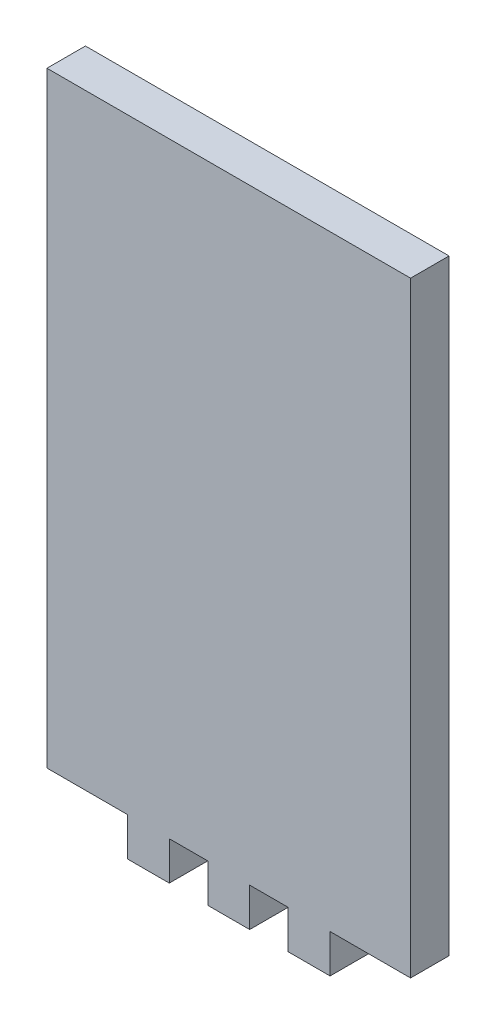
ISO-10303-21;
HEADER;
FILE_DESCRIPTION(('STEP AP214'),'2;1');
FILE_NAME('part.step','',(''),(''),'','','');
FILE_SCHEMA(('AUTOMOTIVE_DESIGN { 1 0 10303 214 1 1 1 1 }'));
ENDSEC;
DATA;
#1=APPLICATION_CONTEXT('core data for automotive mechanical design processes');
#2=APPLICATION_PROTOCOL_DEFINITION('international standard','automotive_design',2000,#1);
#3=PRODUCT_CONTEXT('',#1,'mechanical');
#4=PRODUCT('Part','Part','',(#3));
#5=PRODUCT_RELATED_PRODUCT_CATEGORY('part','',(#4));
#6=PRODUCT_DEFINITION_FORMATION('','',#4);
#7=PRODUCT_DEFINITION_CONTEXT('part definition',#1,'design');
#8=PRODUCT_DEFINITION('design','',#6,#7);
#9=PRODUCT_DEFINITION_SHAPE('','',#8);
#10=(LENGTH_UNIT() NAMED_UNIT(*) SI_UNIT(.MILLI.,.METRE.));
#11=(NAMED_UNIT(*) PLANE_ANGLE_UNIT() SI_UNIT($,.RADIAN.));
#12=(NAMED_UNIT(*) SI_UNIT($,.STERADIAN.) SOLID_ANGLE_UNIT());
#13=UNCERTAINTY_MEASURE_WITH_UNIT(LENGTH_MEASURE(1.E-05),#10,'distance_accuracy_value','');
#14=(GEOMETRIC_REPRESENTATION_CONTEXT(3) GLOBAL_UNCERTAINTY_ASSIGNED_CONTEXT((#13)) GLOBAL_UNIT_ASSIGNED_CONTEXT((#10,
#11,#12)) REPRESENTATION_CONTEXT('',''));
#15=CARTESIAN_POINT('',(0.,0.,0.));
#16=DIRECTION('',(0.,0.,1.));
#17=DIRECTION('',(1.,0.,0.));
#18=AXIS2_PLACEMENT_3D('',#15,#16,#17);
#19=CARTESIAN_POINT('',(60.,6.35,6.35));
#20=DIRECTION('',(-1.,0.,0.));
#21=DIRECTION('',(0.,0.,1.));
#22=AXIS2_PLACEMENT_3D('',#19,#20,#21);
#23=PLANE('',#22);
#24=DIRECTION('',(0.,1.,0.));
#25=VECTOR('',#24,1.);
#26=CARTESIAN_POINT('',(60.,6.35,0.));
#27=LINE('',#26,#25);
#28=CARTESIAN_POINT('',(60.,6.35,0.));
#29=VERTEX_POINT('',#28);
#30=CARTESIAN_POINT('',(60.,106.36,0.));
#31=VERTEX_POINT('',#30);
#32=EDGE_CURVE('E189',#29,#31,#27,.T.);
#33=ORIENTED_EDGE('',*,*,#32,.T.);
#34=DIRECTION('',(0.,0.,-1.));
#35=VECTOR('',#34,1.);
#36=CARTESIAN_POINT('',(60.,106.36,6.35));
#37=LINE('',#36,#35);
#38=CARTESIAN_POINT('',(60.,106.36,6.35));
#39=VERTEX_POINT('',#38);
#40=EDGE_CURVE('E11',#39,#31,#37,.T.);
#41=ORIENTED_EDGE('',*,*,#40,.F.);
#42=DIRECTION('',(0.,1.,0.));
#43=VECTOR('',#42,1.);
#44=CARTESIAN_POINT('',(60.,6.35,6.35));
#45=LINE('',#44,#43);
#46=CARTESIAN_POINT('',(60.,6.35,6.35));
#47=VERTEX_POINT('',#46);
#48=EDGE_CURVE('E237',#47,#39,#45,.T.);
#49=ORIENTED_EDGE('',*,*,#48,.F.);
#50=DIRECTION('',(0.,0.,-1.));
#51=VECTOR('',#50,1.);
#52=CARTESIAN_POINT('',(60.,6.35,6.35));
#53=LINE('',#52,#51);
#54=EDGE_CURVE('E185',#47,#29,#53,.T.);
#55=ORIENTED_EDGE('',*,*,#54,.T.);
#56=EDGE_LOOP('',(#33,#41,#49,#55));
#57=FACE_BOUND('',#56,.T.);
#58=ADVANCED_FACE('F39',(#57),#23,.F.);
#59=CARTESIAN_POINT('',(0.,106.36,6.35));
#60=DIRECTION('',(0.,-1.,0.));
#61=DIRECTION('',(0.,0.,-1.));
#62=AXIS2_PLACEMENT_3D('',#59,#60,#61);
#63=PLANE('',#62);
#64=DIRECTION('',(-1.,0.,0.));
#65=VECTOR('',#64,1.);
#66=CARTESIAN_POINT('',(0.,106.36,0.));
#67=LINE('',#66,#65);
#68=CARTESIAN_POINT('',(0.,106.36,0.));
#69=VERTEX_POINT('',#68);
#70=EDGE_CURVE('E193',#31,#69,#67,.T.);
#71=ORIENTED_EDGE('',*,*,#70,.T.);
#72=DIRECTION('',(0.,0.,-1.));
#73=VECTOR('',#72,1.);
#74=CARTESIAN_POINT('',(0.,106.36,6.35));
#75=LINE('',#74,#73);
#76=CARTESIAN_POINT('',(0.,106.36,6.35));
#77=VERTEX_POINT('',#76);
#78=EDGE_CURVE('E48',#77,#69,#75,.T.);
#79=ORIENTED_EDGE('',*,*,#78,.F.);
#80=DIRECTION('',(-1.,0.,0.));
#81=VECTOR('',#80,1.);
#82=CARTESIAN_POINT('',(0.,106.36,6.35));
#83=LINE('',#82,#81);
#84=EDGE_CURVE('E121',#39,#77,#83,.T.);
#85=ORIENTED_EDGE('',*,*,#84,.F.);
#86=ORIENTED_EDGE('',*,*,#40,.T.);
#87=EDGE_LOOP('',(#71,#79,#85,#86));
#88=FACE_BOUND('',#87,.T.);
#89=ADVANCED_FACE('F351',(#88),#63,.F.);
#90=CARTESIAN_POINT('',(0.,6.35,6.35));
#91=DIRECTION('',(1.,0.,0.));
#92=DIRECTION('',(0.,0.,-1.));
#93=AXIS2_PLACEMENT_3D('',#90,#91,#92);
#94=PLANE('',#93);
#95=DIRECTION('',(0.,-1.,0.));
#96=VECTOR('',#95,1.);
#97=CARTESIAN_POINT('',(0.,6.35,0.));
#98=LINE('',#97,#96);
#99=CARTESIAN_POINT('',(0.,6.35,0.));
#100=VERTEX_POINT('',#99);
#101=EDGE_CURVE('E196',#69,#100,#98,.T.);
#102=ORIENTED_EDGE('',*,*,#101,.T.);
#103=DIRECTION('',(0.,0.,-1.));
#104=VECTOR('',#103,1.);
#105=CARTESIAN_POINT('',(0.,6.35,6.35));
#106=LINE('',#105,#104);
#107=CARTESIAN_POINT('',(0.,6.35,6.35));
#108=VERTEX_POINT('',#107);
#109=EDGE_CURVE('E280',#108,#100,#106,.T.);
#110=ORIENTED_EDGE('',*,*,#109,.F.);
#111=DIRECTION('',(0.,-1.,0.));
#112=VECTOR('',#111,1.);
#113=CARTESIAN_POINT('',(0.,6.35,6.35));
#114=LINE('',#113,#112);
#115=EDGE_CURVE('E290',#77,#108,#114,.T.);
#116=ORIENTED_EDGE('',*,*,#115,.F.);
#117=ORIENTED_EDGE('',*,*,#78,.T.);
#118=EDGE_LOOP('',(#102,#110,#116,#117));
#119=FACE_BOUND('',#118,.T.);
#120=ADVANCED_FACE('F288',(#119),#94,.F.);
#121=CARTESIAN_POINT('',(6.912,6.35,6.35));
#122=DIRECTION('',(0.,1.,0.));
#123=DIRECTION('',(0.,0.,1.));
#124=AXIS2_PLACEMENT_3D('',#121,#122,#123);
#125=PLANE('',#124);
#126=DIRECTION('',(1.,0.,0.));
#127=VECTOR('',#126,1.);
#128=CARTESIAN_POINT('',(6.912,6.35,0.));
#129=LINE('',#128,#127);
#130=CARTESIAN_POINT('',(13.272,6.35,0.));
#131=VERTEX_POINT('',#130);
#132=EDGE_CURVE('E200',#100,#131,#129,.T.);
#133=ORIENTED_EDGE('',*,*,#132,.T.);
#134=DIRECTION('',(0.,0.,-1.));
#135=VECTOR('',#134,1.);
#136=CARTESIAN_POINT('',(13.272,6.35,6.35));
#137=LINE('',#136,#135);
#138=CARTESIAN_POINT('',(13.272,6.35,6.35));
#139=VERTEX_POINT('',#138);
#140=EDGE_CURVE('E276',#139,#131,#137,.T.);
#141=ORIENTED_EDGE('',*,*,#140,.F.);
#142=DIRECTION('',(1.,0.,0.));
#143=VECTOR('',#142,1.);
#144=CARTESIAN_POINT('',(6.912,6.35,6.35));
#145=LINE('',#144,#143);
#146=EDGE_CURVE('E306',#108,#139,#145,.T.);
#147=ORIENTED_EDGE('',*,*,#146,.F.);
#148=ORIENTED_EDGE('',*,*,#109,.T.);
#149=EDGE_LOOP('',(#133,#141,#147,#148));
#150=FACE_BOUND('',#149,.T.);
#151=ADVANCED_FACE('F296',(#150),#125,.F.);
#152=CARTESIAN_POINT('',(13.272,0.,6.35));
#153=DIRECTION('',(1.,0.,0.));
#154=DIRECTION('',(0.,0.,-1.));
#155=AXIS2_PLACEMENT_3D('',#152,#153,#154);
#156=PLANE('',#155);
#157=DIRECTION('',(0.,-1.,0.));
#158=VECTOR('',#157,1.);
#159=CARTESIAN_POINT('',(13.272,0.,0.));
#160=LINE('',#159,#158);
#161=CARTESIAN_POINT('',(13.272,0.,0.));
#162=VERTEX_POINT('',#161);
#163=EDGE_CURVE('E203',#131,#162,#160,.T.);
#164=ORIENTED_EDGE('',*,*,#163,.T.);
#165=DIRECTION('',(0.,0.,-1.));
#166=VECTOR('',#165,1.);
#167=CARTESIAN_POINT('',(13.272,0.,6.35));
#168=LINE('',#167,#166);
#169=CARTESIAN_POINT('',(13.272,0.,6.35));
#170=VERTEX_POINT('',#169);
#171=EDGE_CURVE('E272',#170,#162,#168,.T.);
#172=ORIENTED_EDGE('',*,*,#171,.F.);
#173=DIRECTION('',(0.,-1.,0.));
#174=VECTOR('',#173,1.);
#175=CARTESIAN_POINT('',(13.272,0.,6.35));
#176=LINE('',#175,#174);
#177=EDGE_CURVE('E302',#139,#170,#176,.T.);
#178=ORIENTED_EDGE('',*,*,#177,.F.);
#179=ORIENTED_EDGE('',*,*,#140,.T.);
#180=EDGE_LOOP('',(#164,#172,#178,#179));
#181=FACE_BOUND('',#180,.T.);
#182=ADVANCED_FACE('F300',(#181),#156,.F.);
#183=CARTESIAN_POINT('',(13.272,0.,6.35));
#184=DIRECTION('',(0.,1.,0.));
#185=DIRECTION('',(0.,0.,1.));
#186=AXIS2_PLACEMENT_3D('',#183,#184,#185);
#187=PLANE('',#186);
#188=DIRECTION('',(1.,0.,0.));
#189=VECTOR('',#188,1.);
#190=CARTESIAN_POINT('',(13.272,0.,0.));
#191=LINE('',#190,#189);
#192=CARTESIAN_POINT('',(20.182,0.,0.));
#193=VERTEX_POINT('',#192);
#194=EDGE_CURVE('E206',#162,#193,#191,.T.);
#195=ORIENTED_EDGE('',*,*,#194,.T.);
#196=DIRECTION('',(0.,0.,-1.));
#197=VECTOR('',#196,1.);
#198=CARTESIAN_POINT('',(20.182,0.,6.35));
#199=LINE('',#198,#197);
#200=CARTESIAN_POINT('',(20.182,0.,6.35));
#201=VERTEX_POINT('',#200);
#202=EDGE_CURVE('E268',#201,#193,#199,.T.);
#203=ORIENTED_EDGE('',*,*,#202,.F.);
#204=DIRECTION('',(1.,0.,0.));
#205=VECTOR('',#204,1.);
#206=CARTESIAN_POINT('',(13.272,0.,6.35));
#207=LINE('',#206,#205);
#208=EDGE_CURVE('E305',#170,#201,#207,.T.);
#209=ORIENTED_EDGE('',*,*,#208,.F.);
#210=ORIENTED_EDGE('',*,*,#171,.T.);
#211=EDGE_LOOP('',(#195,#203,#209,#210));
#212=FACE_BOUND('',#211,.T.);
#213=ADVANCED_FACE('F363',(#212),#187,.F.);
#214=CARTESIAN_POINT('',(20.182,0.,6.35));
#215=DIRECTION('',(-1.,0.,0.));
#216=DIRECTION('',(0.,0.,1.));
#217=AXIS2_PLACEMENT_3D('',#214,#215,#216);
#218=PLANE('',#217);
#219=DIRECTION('',(0.,1.,0.));
#220=VECTOR('',#219,1.);
#221=CARTESIAN_POINT('',(20.182,0.,0.));
#222=LINE('',#221,#220);
#223=CARTESIAN_POINT('',(20.182,6.35,0.));
#224=VERTEX_POINT('',#223);
#225=EDGE_CURVE('E209',#193,#224,#222,.T.);
#226=ORIENTED_EDGE('',*,*,#225,.T.);
#227=DIRECTION('',(0.,0.,-1.));
#228=VECTOR('',#227,1.);
#229=CARTESIAN_POINT('',(20.182,6.35,6.35));
#230=LINE('',#229,#228);
#231=CARTESIAN_POINT('',(20.182,6.35,6.35));
#232=VERTEX_POINT('',#231);
#233=EDGE_CURVE('E264',#232,#224,#230,.T.);
#234=ORIENTED_EDGE('',*,*,#233,.F.);
#235=DIRECTION('',(0.,1.,0.));
#236=VECTOR('',#235,1.);
#237=CARTESIAN_POINT('',(20.182,0.,6.35));
#238=LINE('',#237,#236);
#239=EDGE_CURVE('E310',#201,#232,#238,.T.);
#240=ORIENTED_EDGE('',*,*,#239,.F.);
#241=ORIENTED_EDGE('',*,*,#202,.T.);
#242=EDGE_LOOP('',(#226,#234,#240,#241));
#243=FACE_BOUND('',#242,.T.);
#244=ADVANCED_FACE('F366',(#243),#218,.F.);
#245=CARTESIAN_POINT('',(20.182,6.35,6.35));
#246=DIRECTION('',(0.,1.,0.));
#247=DIRECTION('',(0.,0.,1.));
#248=AXIS2_PLACEMENT_3D('',#245,#246,#247);
#249=PLANE('',#248);
#250=DIRECTION('',(1.,0.,0.));
#251=VECTOR('',#250,1.);
#252=CARTESIAN_POINT('',(20.182,6.35,0.));
#253=LINE('',#252,#251);
#254=CARTESIAN_POINT('',(26.542,6.35,0.));
#255=VERTEX_POINT('',#254);
#256=EDGE_CURVE('E212',#224,#255,#253,.T.);
#257=ORIENTED_EDGE('',*,*,#256,.T.);
#258=DIRECTION('',(0.,0.,-1.));
#259=VECTOR('',#258,1.);
#260=CARTESIAN_POINT('',(26.542,6.35,6.35));
#261=LINE('',#260,#259);
#262=CARTESIAN_POINT('',(26.542,6.35,6.35));
#263=VERTEX_POINT('',#262);
#264=EDGE_CURVE('E260',#263,#255,#261,.T.);
#265=ORIENTED_EDGE('',*,*,#264,.F.);
#266=DIRECTION('',(1.,0.,0.));
#267=VECTOR('',#266,1.);
#268=CARTESIAN_POINT('',(20.182,6.35,6.35));
#269=LINE('',#268,#267);
#270=EDGE_CURVE('E317',#232,#263,#269,.T.);
#271=ORIENTED_EDGE('',*,*,#270,.F.);
#272=ORIENTED_EDGE('',*,*,#233,.T.);
#273=EDGE_LOOP('',(#257,#265,#271,#272));
#274=FACE_BOUND('',#273,.T.);
#275=ADVANCED_FACE('F370',(#274),#249,.F.);
#276=CARTESIAN_POINT('',(26.542,0.,6.35));
#277=DIRECTION('',(1.,0.,0.));
#278=DIRECTION('',(0.,0.,-1.));
#279=AXIS2_PLACEMENT_3D('',#276,#277,#278);
#280=PLANE('',#279);
#281=DIRECTION('',(0.,-1.,0.));
#282=VECTOR('',#281,1.);
#283=CARTESIAN_POINT('',(26.542,0.,0.));
#284=LINE('',#283,#282);
#285=CARTESIAN_POINT('',(26.542,0.,0.));
#286=VERTEX_POINT('',#285);
#287=EDGE_CURVE('E215',#255,#286,#284,.T.);
#288=ORIENTED_EDGE('',*,*,#287,.T.);
#289=DIRECTION('',(0.,0.,-1.));
#290=VECTOR('',#289,1.);
#291=CARTESIAN_POINT('',(26.542,0.,6.35));
#292=LINE('',#291,#290);
#293=CARTESIAN_POINT('',(26.542,0.,6.35));
#294=VERTEX_POINT('',#293);
#295=EDGE_CURVE('E256',#294,#286,#292,.T.);
#296=ORIENTED_EDGE('',*,*,#295,.F.);
#297=DIRECTION('',(0.,-1.,0.));
#298=VECTOR('',#297,1.);
#299=CARTESIAN_POINT('',(26.542,0.,6.35));
#300=LINE('',#299,#298);
#301=EDGE_CURVE('E320',#263,#294,#300,.T.);
#302=ORIENTED_EDGE('',*,*,#301,.F.);
#303=ORIENTED_EDGE('',*,*,#264,.T.);
#304=EDGE_LOOP('',(#288,#296,#302,#303));
#305=FACE_BOUND('',#304,.T.);
#306=ADVANCED_FACE('F374',(#305),#280,.F.);
#307=CARTESIAN_POINT('',(26.542,0.,6.35));
#308=DIRECTION('',(0.,1.,0.));
#309=DIRECTION('',(0.,0.,1.));
#310=AXIS2_PLACEMENT_3D('',#307,#308,#309);
#311=PLANE('',#310);
#312=DIRECTION('',(1.,0.,0.));
#313=VECTOR('',#312,1.);
#314=CARTESIAN_POINT('',(26.542,0.,0.));
#315=LINE('',#314,#313);
#316=CARTESIAN_POINT('',(33.452,0.,0.));
#317=VERTEX_POINT('',#316);
#318=EDGE_CURVE('E218',#286,#317,#315,.T.);
#319=ORIENTED_EDGE('',*,*,#318,.T.);
#320=DIRECTION('',(0.,0.,-1.));
#321=VECTOR('',#320,1.);
#322=CARTESIAN_POINT('',(33.452,0.,6.35));
#323=LINE('',#322,#321);
#324=CARTESIAN_POINT('',(33.452,0.,6.35));
#325=VERTEX_POINT('',#324);
#326=EDGE_CURVE('E252',#325,#317,#323,.T.);
#327=ORIENTED_EDGE('',*,*,#326,.F.);
#328=DIRECTION('',(1.,0.,0.));
#329=VECTOR('',#328,1.);
#330=CARTESIAN_POINT('',(26.542,0.,6.35));
#331=LINE('',#330,#329);
#332=EDGE_CURVE('E323',#294,#325,#331,.T.);
#333=ORIENTED_EDGE('',*,*,#332,.F.);
#334=ORIENTED_EDGE('',*,*,#295,.T.);
#335=EDGE_LOOP('',(#319,#327,#333,#334));
#336=FACE_BOUND('',#335,.T.);
#337=ADVANCED_FACE('F378',(#336),#311,.F.);
#338=CARTESIAN_POINT('',(33.452,0.,6.35));
#339=DIRECTION('',(-1.,0.,0.));
#340=DIRECTION('',(0.,0.,1.));
#341=AXIS2_PLACEMENT_3D('',#338,#339,#340);
#342=PLANE('',#341);
#343=DIRECTION('',(0.,1.,0.));
#344=VECTOR('',#343,1.);
#345=CARTESIAN_POINT('',(33.452,0.,0.));
#346=LINE('',#345,#344);
#347=CARTESIAN_POINT('',(33.452,6.35,0.));
#348=VERTEX_POINT('',#347);
#349=EDGE_CURVE('E221',#317,#348,#346,.T.);
#350=ORIENTED_EDGE('',*,*,#349,.T.);
#351=DIRECTION('',(0.,0.,-1.));
#352=VECTOR('',#351,1.);
#353=CARTESIAN_POINT('',(33.452,6.35,6.35));
#354=LINE('',#353,#352);
#355=CARTESIAN_POINT('',(33.452,6.35,6.35));
#356=VERTEX_POINT('',#355);
#357=EDGE_CURVE('E248',#356,#348,#354,.T.);
#358=ORIENTED_EDGE('',*,*,#357,.F.);
#359=DIRECTION('',(0.,1.,0.));
#360=VECTOR('',#359,1.);
#361=CARTESIAN_POINT('',(33.452,0.,6.35));
#362=LINE('',#361,#360);
#363=EDGE_CURVE('E326',#325,#356,#362,.T.);
#364=ORIENTED_EDGE('',*,*,#363,.F.);
#365=ORIENTED_EDGE('',*,*,#326,.T.);
#366=EDGE_LOOP('',(#350,#358,#364,#365));
#367=FACE_BOUND('',#366,.T.);
#368=ADVANCED_FACE('F382',(#367),#342,.F.);
#369=CARTESIAN_POINT('',(33.452,6.35,6.35));
#370=DIRECTION('',(0.,1.,0.));
#371=DIRECTION('',(0.,0.,1.));
#372=AXIS2_PLACEMENT_3D('',#369,#370,#371);
#373=PLANE('',#372);
#374=DIRECTION('',(1.,0.,0.));
#375=VECTOR('',#374,1.);
#376=CARTESIAN_POINT('',(33.452,6.35,0.));
#377=LINE('',#376,#375);
#378=CARTESIAN_POINT('',(39.812,6.35,0.));
#379=VERTEX_POINT('',#378);
#380=EDGE_CURVE('E224',#348,#379,#377,.T.);
#381=ORIENTED_EDGE('',*,*,#380,.T.);
#382=DIRECTION('',(0.,0.,-1.));
#383=VECTOR('',#382,1.);
#384=CARTESIAN_POINT('',(39.812,6.35,6.35));
#385=LINE('',#384,#383);
#386=CARTESIAN_POINT('',(39.812,6.35,6.35));
#387=VERTEX_POINT('',#386);
#388=EDGE_CURVE('E244',#387,#379,#385,.T.);
#389=ORIENTED_EDGE('',*,*,#388,.F.);
#390=DIRECTION('',(1.,0.,0.));
#391=VECTOR('',#390,1.);
#392=CARTESIAN_POINT('',(33.452,6.35,6.35));
#393=LINE('',#392,#391);
#394=EDGE_CURVE('E329',#356,#387,#393,.T.);
#395=ORIENTED_EDGE('',*,*,#394,.F.);
#396=ORIENTED_EDGE('',*,*,#357,.T.);
#397=EDGE_LOOP('',(#381,#389,#395,#396));
#398=FACE_BOUND('',#397,.T.);
#399=ADVANCED_FACE('F337',(#398),#373,.F.);
#400=CARTESIAN_POINT('',(39.812,0.,6.35));
#401=DIRECTION('',(1.,0.,0.));
#402=DIRECTION('',(0.,1.,0.));
#403=AXIS2_PLACEMENT_3D('',#400,#401,#402);
#404=PLANE('',#403);
#405=DIRECTION('',(0.,-1.,0.));
#406=VECTOR('',#405,1.);
#407=CARTESIAN_POINT('',(39.812,0.,0.));
#408=LINE('',#407,#406);
#409=CARTESIAN_POINT('',(39.812,0.,0.));
#410=VERTEX_POINT('',#409);
#411=EDGE_CURVE('E227',#379,#410,#408,.T.);
#412=ORIENTED_EDGE('',*,*,#411,.T.);
#413=DIRECTION('',(0.,0.,-1.));
#414=VECTOR('',#413,1.);
#415=CARTESIAN_POINT('',(39.812,0.,6.35));
#416=LINE('',#415,#414);
#417=CARTESIAN_POINT('',(39.812,0.,6.35));
#418=VERTEX_POINT('',#417);
#419=EDGE_CURVE('E178',#418,#410,#416,.T.);
#420=ORIENTED_EDGE('',*,*,#419,.F.);
#421=DIRECTION('',(0.,-1.,0.));
#422=VECTOR('',#421,1.);
#423=CARTESIAN_POINT('',(39.812,0.,6.35));
#424=LINE('',#423,#422);
#425=EDGE_CURVE('E165',#387,#418,#424,.T.);
#426=ORIENTED_EDGE('',*,*,#425,.F.);
#427=ORIENTED_EDGE('',*,*,#388,.T.);
#428=EDGE_LOOP('',(#412,#420,#426,#427));
#429=FACE_BOUND('',#428,.T.);
#430=ADVANCED_FACE('F341',(#429),#404,.F.);
#431=CARTESIAN_POINT('',(39.812,0.,6.35));
#432=DIRECTION('',(0.,1.,0.));
#433=DIRECTION('',(0.,0.,1.));
#434=AXIS2_PLACEMENT_3D('',#431,#432,#433);
#435=PLANE('',#434);
#436=DIRECTION('',(1.,0.,0.));
#437=VECTOR('',#436,1.);
#438=CARTESIAN_POINT('',(39.812,0.,0.));
#439=LINE('',#438,#437);
#440=CARTESIAN_POINT('',(46.722,0.,0.));
#441=VERTEX_POINT('',#440);
#442=EDGE_CURVE('E175',#410,#441,#439,.T.);
#443=ORIENTED_EDGE('',*,*,#442,.T.);
#444=DIRECTION('',(0.,0.,-1.));
#445=VECTOR('',#444,1.);
#446=CARTESIAN_POINT('',(46.722,0.,6.35));
#447=LINE('',#446,#445);
#448=CARTESIAN_POINT('',(46.722,0.,6.35));
#449=VERTEX_POINT('',#448);
#450=EDGE_CURVE('E172',#449,#441,#447,.T.);
#451=ORIENTED_EDGE('',*,*,#450,.F.);
#452=DIRECTION('',(1.,0.,0.));
#453=VECTOR('',#452,1.);
#454=CARTESIAN_POINT('',(39.812,0.,6.35));
#455=LINE('',#454,#453);
#456=EDGE_CURVE('E158',#418,#449,#455,.T.);
#457=ORIENTED_EDGE('',*,*,#456,.F.);
#458=ORIENTED_EDGE('',*,*,#419,.T.);
#459=EDGE_LOOP('',(#443,#451,#457,#458));
#460=FACE_BOUND('',#459,.T.);
#461=ADVANCED_FACE('F173',(#460),#435,.F.);
#462=CARTESIAN_POINT('',(46.722,0.,6.35));
#463=DIRECTION('',(-1.,0.,0.));
#464=DIRECTION('',(0.,-1.,0.));
#465=AXIS2_PLACEMENT_3D('',#462,#463,#464);
#466=PLANE('',#465);
#467=DIRECTION('',(0.,1.,0.));
#468=VECTOR('',#467,1.);
#469=CARTESIAN_POINT('',(46.722,0.,0.));
#470=LINE('',#469,#468);
#471=CARTESIAN_POINT('',(46.722,6.35,0.));
#472=VERTEX_POINT('',#471);
#473=EDGE_CURVE('E232',#441,#472,#470,.T.);
#474=ORIENTED_EDGE('',*,*,#473,.T.);
#475=DIRECTION('',(0.,0.,-1.));
#476=VECTOR('',#475,1.);
#477=CARTESIAN_POINT('',(46.722,6.35,6.35));
#478=LINE('',#477,#476);
#479=CARTESIAN_POINT('',(46.722,6.35,6.35));
#480=VERTEX_POINT('',#479);
#481=EDGE_CURVE('E179',#480,#472,#478,.T.);
#482=ORIENTED_EDGE('',*,*,#481,.F.);
#483=DIRECTION('',(0.,1.,0.));
#484=VECTOR('',#483,1.);
#485=CARTESIAN_POINT('',(46.722,0.,6.35));
#486=LINE('',#485,#484);
#487=EDGE_CURVE('E162',#449,#480,#486,.T.);
#488=ORIENTED_EDGE('',*,*,#487,.F.);
#489=ORIENTED_EDGE('',*,*,#450,.T.);
#490=EDGE_LOOP('',(#474,#482,#488,#489));
#491=FACE_BOUND('',#490,.T.);
#492=ADVANCED_FACE('F181',(#491),#466,.F.);
#493=CARTESIAN_POINT('',(53.082,6.35,6.35));
#494=DIRECTION('',(0.,1.,0.));
#495=DIRECTION('',(0.,0.,1.));
#496=AXIS2_PLACEMENT_3D('',#493,#494,#495);
#497=PLANE('',#496);
#498=DIRECTION('',(1.,0.,0.));
#499=VECTOR('',#498,1.);
#500=CARTESIAN_POINT('',(53.082,6.35,0.));
#501=LINE('',#500,#499);
#502=EDGE_CURVE('E109',#472,#29,#501,.T.);
#503=ORIENTED_EDGE('',*,*,#502,.T.);
#504=ORIENTED_EDGE('',*,*,#54,.F.);
#505=DIRECTION('',(1.,0.,0.));
#506=VECTOR('',#505,1.);
#507=CARTESIAN_POINT('',(46.722,6.35,6.35));
#508=LINE('',#507,#506);
#509=EDGE_CURVE('E56',#480,#47,#508,.T.);
#510=ORIENTED_EDGE('',*,*,#509,.F.);
#511=ORIENTED_EDGE('',*,*,#481,.T.);
#512=EDGE_LOOP('',(#503,#504,#510,#511));
#513=FACE_BOUND('',#512,.T.);
#514=ADVANCED_FACE('F342',(#513),#497,.F.);
#515=CARTESIAN_POINT('',(0.,0.,6.35));
#516=DIRECTION('',(0.,0.,-1.));
#517=DIRECTION('',(-1.,0.,0.));
#518=AXIS2_PLACEMENT_3D('',#515,#516,#517);
#519=PLANE('',#518);
#520=ORIENTED_EDGE('',*,*,#48,.T.);
#521=ORIENTED_EDGE('',*,*,#84,.T.);
#522=ORIENTED_EDGE('',*,*,#115,.T.);
#523=ORIENTED_EDGE('',*,*,#146,.T.);
#524=ORIENTED_EDGE('',*,*,#177,.T.);
#525=ORIENTED_EDGE('',*,*,#208,.T.);
#526=ORIENTED_EDGE('',*,*,#239,.T.);
#527=ORIENTED_EDGE('',*,*,#270,.T.);
#528=ORIENTED_EDGE('',*,*,#301,.T.);
#529=ORIENTED_EDGE('',*,*,#332,.T.);
#530=ORIENTED_EDGE('',*,*,#363,.T.);
#531=ORIENTED_EDGE('',*,*,#394,.T.);
#532=ORIENTED_EDGE('',*,*,#425,.T.);
#533=ORIENTED_EDGE('',*,*,#456,.T.);
#534=ORIENTED_EDGE('',*,*,#487,.T.);
#535=ORIENTED_EDGE('',*,*,#509,.T.);
#536=EDGE_LOOP('',(#520,#521,#522,#523,#524,#525,#526,#527,#528,#529,#530,#531,#532,#533,#534,#535));
#537=FACE_BOUND('',#536,.T.);
#538=ADVANCED_FACE('F160',(#537),#519,.F.);
#539=CARTESIAN_POINT('',(0.,0.,0.));
#540=DIRECTION('',(0.,0.,-1.));
#541=DIRECTION('',(-1.,0.,0.));
#542=AXIS2_PLACEMENT_3D('',#539,#540,#541);
#543=PLANE('',#542);
#544=ORIENTED_EDGE('',*,*,#32,.F.);
#545=ORIENTED_EDGE('',*,*,#502,.F.);
#546=ORIENTED_EDGE('',*,*,#473,.F.);
#547=ORIENTED_EDGE('',*,*,#442,.F.);
#548=ORIENTED_EDGE('',*,*,#411,.F.);
#549=ORIENTED_EDGE('',*,*,#380,.F.);
#550=ORIENTED_EDGE('',*,*,#349,.F.);
#551=ORIENTED_EDGE('',*,*,#318,.F.);
#552=ORIENTED_EDGE('',*,*,#287,.F.);
#553=ORIENTED_EDGE('',*,*,#256,.F.);
#554=ORIENTED_EDGE('',*,*,#225,.F.);
#555=ORIENTED_EDGE('',*,*,#194,.F.);
#556=ORIENTED_EDGE('',*,*,#163,.F.);
#557=ORIENTED_EDGE('',*,*,#132,.F.);
#558=ORIENTED_EDGE('',*,*,#101,.F.);
#559=ORIENTED_EDGE('',*,*,#70,.F.);
#560=EDGE_LOOP('',(#544,#545,#546,#547,#548,#549,#550,#551,#552,#553,#554,#555,#556,#557,#558,#559));
#561=FACE_BOUND('',#560,.T.);
#562=ADVANCED_FACE('F291',(#561),#543,.T.);
#563=CLOSED_SHELL('',(#58,#89,#120,#151,#182,#213,#244,#275,#306,#337,#368,#399,#430,#461,#492,
#514,#538,#562));
#564=MANIFOLD_SOLID_BREP('B2',#563);
#565=ADVANCED_BREP_SHAPE_REPRESENTATION('',(#18,#564),#14);
#566=SHAPE_DEFINITION_REPRESENTATION(#9,#565);
ENDSEC;
END-ISO-10303-21;
